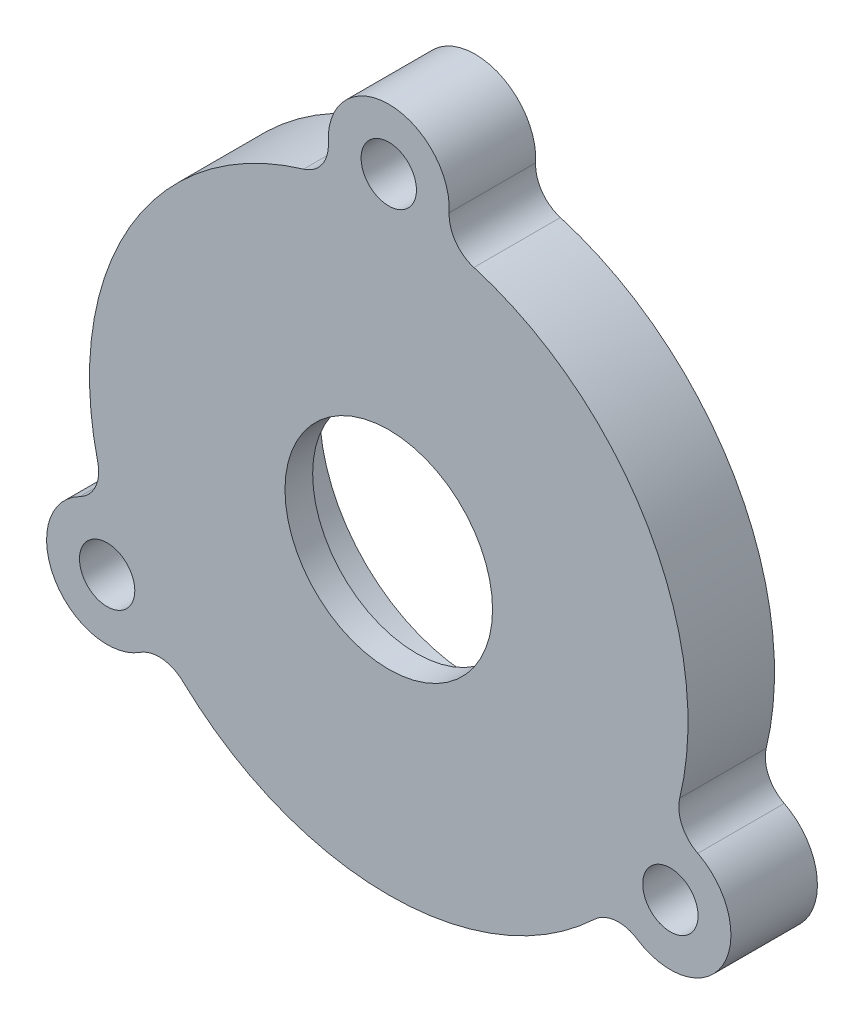
ISO-10303-21;
HEADER;
FILE_DESCRIPTION(('STEP AP214'),'2;1');
FILE_NAME('part.step','',(''),(''),'','','');
FILE_SCHEMA(('AUTOMOTIVE_DESIGN { 1 0 10303 214 1 1 1 1 }'));
ENDSEC;
DATA;
#1=APPLICATION_CONTEXT('core data for automotive mechanical design processes');
#2=APPLICATION_PROTOCOL_DEFINITION('international standard','automotive_design',2000,#1);
#3=PRODUCT_CONTEXT('',#1,'mechanical');
#4=PRODUCT('Part','Part','',(#3));
#5=PRODUCT_RELATED_PRODUCT_CATEGORY('part','',(#4));
#6=PRODUCT_DEFINITION_FORMATION('','',#4);
#7=PRODUCT_DEFINITION_CONTEXT('part definition',#1,'design');
#8=PRODUCT_DEFINITION('design','',#6,#7);
#9=PRODUCT_DEFINITION_SHAPE('','',#8);
#10=(LENGTH_UNIT() NAMED_UNIT(*) SI_UNIT(.MILLI.,.METRE.));
#11=(NAMED_UNIT(*) PLANE_ANGLE_UNIT() SI_UNIT($,.RADIAN.));
#12=(NAMED_UNIT(*) SI_UNIT($,.STERADIAN.) SOLID_ANGLE_UNIT());
#13=UNCERTAINTY_MEASURE_WITH_UNIT(LENGTH_MEASURE(1.E-05),#10,'distance_accuracy_value','');
#14=(GEOMETRIC_REPRESENTATION_CONTEXT(3) GLOBAL_UNCERTAINTY_ASSIGNED_CONTEXT((#13)) GLOBAL_UNIT_ASSIGNED_CONTEXT((#10,
#11,#12)) REPRESENTATION_CONTEXT('',''));
#15=CARTESIAN_POINT('',(0.,0.,0.));
#16=DIRECTION('',(0.,0.,1.));
#17=DIRECTION('',(1.,0.,0.));
#18=AXIS2_PLACEMENT_3D('',#15,#16,#17);
#19=CARTESIAN_POINT('',(0.,9.4,0.));
#20=DIRECTION('',(0.,0.,1.));
#21=DIRECTION('',(1.,0.,0.));
#22=AXIS2_PLACEMENT_3D('',#19,#20,#21);
#23=PLANE('',#22);
#24=CARTESIAN_POINT('',(0.,0.,0.));
#25=DIRECTION('',(0.,0.,-1.));
#26=DIRECTION('',(-1.,0.,0.));
#27=AXIS2_PLACEMENT_3D('',#24,#25,#26);
#28=CIRCLE('',#27,9.);
#29=CARTESIAN_POINT('',(-9.,0.,0.));
#30=VERTEX_POINT('',#29);
#31=EDGE_CURVE('E364',#30,#30,#28,.T.);
#32=ORIENTED_EDGE('',*,*,#31,.F.);
#33=EDGE_LOOP('',(#32));
#34=FACE_BOUND('',#33,.T.);
#35=CARTESIAN_POINT('',(0.,0.,0.));
#36=DIRECTION('',(0.,0.,-1.));
#37=DIRECTION('',(-1.,0.,0.));
#38=AXIS2_PLACEMENT_3D('',#35,#36,#37);
#39=CIRCLE('',#38,11.7);
#40=CARTESIAN_POINT('',(-11.7,0.,0.));
#41=VERTEX_POINT('',#40);
#42=EDGE_CURVE('E301',#41,#41,#39,.T.);
#43=ORIENTED_EDGE('',*,*,#42,.T.);
#44=EDGE_LOOP('',(#43));
#45=FACE_BOUND('',#44,.T.);
#46=ADVANCED_FACE('F37',(#34,#45),#23,.F.);
#47=CARTESIAN_POINT('',(0.,9.4,5.));
#48=DIRECTION('',(0.,0.,1.));
#49=DIRECTION('',(1.,0.,0.));
#50=AXIS2_PLACEMENT_3D('',#47,#48,#49);
#51=PLANE('',#50);
#52=CARTESIAN_POINT('',(16.2812775911475,-9.4,5.));
#53=DIRECTION('',(0.,0.,1.));
#54=DIRECTION('',(1.,0.,0.));
#55=AXIS2_PLACEMENT_3D('',#52,#53,#54);
#56=CIRCLE('',#55,1.6);
#57=CARTESIAN_POINT('',(17.8812775911475,-9.4,5.));
#58=VERTEX_POINT('',#57);
#59=EDGE_CURVE('E311',#58,#58,#56,.T.);
#60=ORIENTED_EDGE('',*,*,#59,.F.);
#61=EDGE_LOOP('',(#60));
#62=FACE_BOUND('',#61,.T.);
#63=CARTESIAN_POINT('',(0.,0.,5.));
#64=DIRECTION('',(0.,0.,1.));
#65=DIRECTION('',(1.,0.,0.));
#66=AXIS2_PLACEMENT_3D('',#63,#64,#65);
#67=CIRCLE('',#66,6.);
#68=CARTESIAN_POINT('',(6.,0.,5.));
#69=VERTEX_POINT('',#68);
#70=EDGE_CURVE('E153',#69,#69,#67,.T.);
#71=ORIENTED_EDGE('',*,*,#70,.F.);
#72=EDGE_LOOP('',(#71));
#73=FACE_BOUND('',#72,.T.);
#74=CARTESIAN_POINT('',(16.2812775911475,-9.4,5.));
#75=DIRECTION('',(0.,0.,1.));
#76=DIRECTION('',(1.,0.,0.));
#77=AXIS2_PLACEMENT_3D('',#74,#75,#76);
#78=CIRCLE('',#77,3.5);
#79=CARTESIAN_POINT('',(14.3696864320163,-12.331862759464,5.));
#80=VERTEX_POINT('',#79);
#81=CARTESIAN_POINT('',(17.8645496416872,-6.2785821148107,5.));
#82=VERTEX_POINT('',#81);
#83=EDGE_CURVE('E161',#80,#82,#78,.T.);
#84=ORIENTED_EDGE('',*,*,#83,.T.);
#85=CARTESIAN_POINT('',(18.7692765277099,-4.49491475184538,5.));
#86=DIRECTION('',(0.,0.,1.));
#87=DIRECTION('',(1.,0.,0.));
#88=AXIS2_PLACEMENT_3D('',#85,#86,#87);
#89=CIRCLE('',#88,2.);
#90=CARTESIAN_POINT('',(16.8242737787244,-4.02912047704275,5.));
#91=VERTEX_POINT('',#90);
#92=EDGE_CURVE('E137',#82,#91,#89,.F.);
#93=ORIENTED_EDGE('',*,*,#92,.T.);
#94=CARTESIAN_POINT('',(0.,0.,5.));
#95=DIRECTION('',(0.,0.,1.));
#96=DIRECTION('',(1.,0.,0.));
#97=AXIS2_PLACEMENT_3D('',#94,#95,#96);
#98=CIRCLE('',#97,17.3);
#99=CARTESIAN_POINT('',(4.92281620133512,16.5848087311212,5.));
#100=VERTEX_POINT('',#99);
#101=EDGE_CURVE('E145',#91,#100,#98,.T.);
#102=ORIENTED_EDGE('',*,*,#101,.T.);
#103=CARTESIAN_POINT('',(5.49192790091143,18.5021276595745,5.));
#104=DIRECTION('',(0.,0.,1.));
#105=DIRECTION('',(1.,0.,0.));
#106=AXIS2_PLACEMENT_3D('',#103,#104,#105);
#107=CIRCLE('',#106,2.);
#108=CARTESIAN_POINT('',(3.49486320967091,18.6104448742747,5.));
#109=VERTEX_POINT('',#108);
#110=EDGE_CURVE('E12',#100,#109,#107,.F.);
#111=ORIENTED_EDGE('',*,*,#110,.T.);
#112=CARTESIAN_POINT('',(0.,18.8,5.));
#113=DIRECTION('',(0.,0.,1.));
#114=DIRECTION('',(1.,0.,0.));
#115=AXIS2_PLACEMENT_3D('',#112,#113,#114);
#116=CIRCLE('',#115,3.5);
#117=CARTESIAN_POINT('',(-3.49486320967091,18.6104448742747,5.));
#118=VERTEX_POINT('',#117);
#119=EDGE_CURVE('E222',#109,#118,#116,.T.);
#120=ORIENTED_EDGE('',*,*,#119,.T.);
#121=CARTESIAN_POINT('',(-5.49192790091143,18.5021276595745,5.));
#122=DIRECTION('',(0.,0.,1.));
#123=DIRECTION('',(1.,0.,0.));
#124=AXIS2_PLACEMENT_3D('',#121,#122,#123);
#125=CIRCLE('',#124,2.);
#126=CARTESIAN_POINT('',(-4.92281620133512,16.5848087311212,5.));
#127=VERTEX_POINT('',#126);
#128=EDGE_CURVE('E212',#118,#127,#125,.F.);
#129=ORIENTED_EDGE('',*,*,#128,.T.);
#130=CARTESIAN_POINT('',(0.,0.,5.));
#131=DIRECTION('',(0.,0.,1.));
#132=DIRECTION('',(1.,0.,0.));
#133=AXIS2_PLACEMENT_3D('',#130,#131,#132);
#134=CIRCLE('',#133,17.3);
#135=CARTESIAN_POINT('',(-16.8242737787244,-4.02912047704276,5.));
#136=VERTEX_POINT('',#135);
#137=EDGE_CURVE('E220',#127,#136,#134,.T.);
#138=ORIENTED_EDGE('',*,*,#137,.T.);
#139=CARTESIAN_POINT('',(-18.7692765277099,-4.4949147518454,5.));
#140=DIRECTION('',(0.,0.,1.));
#141=DIRECTION('',(1.,0.,0.));
#142=AXIS2_PLACEMENT_3D('',#139,#140,#141);
#143=CIRCLE('',#142,2.);
#144=CARTESIAN_POINT('',(-17.8645496416872,-6.27858211481071,5.));
#145=VERTEX_POINT('',#144);
#146=EDGE_CURVE('E208',#136,#145,#143,.F.);
#147=ORIENTED_EDGE('',*,*,#146,.T.);
#148=CARTESIAN_POINT('',(-16.2812775911474,-9.40000000000001,5.));
#149=DIRECTION('',(0.,0.,1.));
#150=DIRECTION('',(1.,0.,0.));
#151=AXIS2_PLACEMENT_3D('',#148,#149,#150);
#152=CIRCLE('',#151,3.5);
#153=CARTESIAN_POINT('',(-14.3696864320163,-12.331862759464,5.));
#154=VERTEX_POINT('',#153);
#155=EDGE_CURVE('E229',#145,#154,#152,.T.);
#156=ORIENTED_EDGE('',*,*,#155,.T.);
#157=CARTESIAN_POINT('',(-13.2773486267985,-14.0072129077291,5.));
#158=DIRECTION('',(0.,0.,1.));
#159=DIRECTION('',(1.,0.,0.));
#160=AXIS2_PLACEMENT_3D('',#157,#158,#159);
#161=CIRCLE('',#160,2.);
#162=CARTESIAN_POINT('',(-11.9014575773893,-12.5556882540784,5.));
#163=VERTEX_POINT('',#162);
#164=EDGE_CURVE('E204',#154,#163,#161,.F.);
#165=ORIENTED_EDGE('',*,*,#164,.T.);
#166=CARTESIAN_POINT('',(0.,0.,5.));
#167=DIRECTION('',(0.,0.,1.));
#168=DIRECTION('',(1.,0.,0.));
#169=AXIS2_PLACEMENT_3D('',#166,#167,#168);
#170=CIRCLE('',#169,17.3);
#171=CARTESIAN_POINT('',(11.9014575773893,-12.5556882540784,5.));
#172=VERTEX_POINT('',#171);
#173=EDGE_CURVE('E240',#163,#172,#170,.T.);
#174=ORIENTED_EDGE('',*,*,#173,.T.);
#175=CARTESIAN_POINT('',(13.2773486267985,-14.0072129077291,5.));
#176=DIRECTION('',(0.,0.,1.));
#177=DIRECTION('',(1.,0.,0.));
#178=AXIS2_PLACEMENT_3D('',#175,#176,#177);
#179=CIRCLE('',#178,2.);
#180=EDGE_CURVE('E200',#172,#80,#179,.F.);
#181=ORIENTED_EDGE('',*,*,#180,.T.);
#182=EDGE_LOOP('',(#84,#93,#102,#111,#120,#129,#138,#147,#156,#165,#174,#181));
#183=FACE_BOUND('',#182,.T.);
#184=CARTESIAN_POINT('',(0.,18.8,5.));
#185=DIRECTION('',(0.,0.,1.));
#186=DIRECTION('',(1.,0.,0.));
#187=AXIS2_PLACEMENT_3D('',#184,#185,#186);
#188=CIRCLE('',#187,1.6);
#189=CARTESIAN_POINT('',(1.6,18.8,5.));
#190=VERTEX_POINT('',#189);
#191=EDGE_CURVE('E158',#190,#190,#188,.T.);
#192=ORIENTED_EDGE('',*,*,#191,.F.);
#193=EDGE_LOOP('',(#192));
#194=FACE_BOUND('',#193,.T.);
#195=CARTESIAN_POINT('',(-16.2812775911474,-9.40000000000001,5.));
#196=DIRECTION('',(0.,0.,1.));
#197=DIRECTION('',(1.,0.,0.));
#198=AXIS2_PLACEMENT_3D('',#195,#196,#197);
#199=CIRCLE('',#198,1.6);
#200=CARTESIAN_POINT('',(-14.6812775911474,-9.40000000000001,5.));
#201=VERTEX_POINT('',#200);
#202=EDGE_CURVE('E305',#201,#201,#199,.T.);
#203=ORIENTED_EDGE('',*,*,#202,.F.);
#204=EDGE_LOOP('',(#203));
#205=FACE_BOUND('',#204,.T.);
#206=ADVANCED_FACE('F218',(#62,#73,#183,#194,#205),#51,.T.);
#207=CARTESIAN_POINT('',(0.,0.,0.));
#208=DIRECTION('',(0.,0.,-1.));
#209=DIRECTION('',(-1.,0.,0.));
#210=AXIS2_PLACEMENT_3D('',#207,#208,#209);
#211=CIRCLE('',#210,15.8);
#212=CARTESIAN_POINT('',(-15.8,0.,0.));
#213=VERTEX_POINT('',#212);
#214=EDGE_CURVE('E292',#213,#213,#211,.T.);
#215=ORIENTED_EDGE('',*,*,#214,.F.);
#216=EDGE_LOOP('',(#215));
#217=FACE_BOUND('',#216,.T.);
#218=CARTESIAN_POINT('',(0.,0.,0.));
#219=DIRECTION('',(0.,0.,1.));
#220=DIRECTION('',(1.,0.,0.));
#221=AXIS2_PLACEMENT_3D('',#218,#219,#220);
#222=CIRCLE('',#221,17.3);
#223=CARTESIAN_POINT('',(16.8242737787244,-4.02912047704275,0.));
#224=VERTEX_POINT('',#223);
#225=CARTESIAN_POINT('',(4.92281620133512,16.5848087311212,0.));
#226=VERTEX_POINT('',#225);
#227=EDGE_CURVE('E143',#224,#226,#222,.T.);
#228=ORIENTED_EDGE('',*,*,#227,.F.);
#229=CARTESIAN_POINT('',(18.7692765277099,-4.49491475184538,0.));
#230=DIRECTION('',(0.,0.,1.));
#231=DIRECTION('',(1.,0.,0.));
#232=AXIS2_PLACEMENT_3D('',#229,#230,#231);
#233=CIRCLE('',#232,2.);
#234=CARTESIAN_POINT('',(17.8645496416872,-6.2785821148107,0.));
#235=VERTEX_POINT('',#234);
#236=EDGE_CURVE('E127',#224,#235,#233,.T.);
#237=ORIENTED_EDGE('',*,*,#236,.T.);
#238=CARTESIAN_POINT('',(16.2812775911475,-9.4,0.));
#239=DIRECTION('',(0.,0.,1.));
#240=DIRECTION('',(1.,0.,0.));
#241=AXIS2_PLACEMENT_3D('',#238,#239,#240);
#242=CIRCLE('',#241,3.5);
#243=CARTESIAN_POINT('',(14.3696864320163,-12.331862759464,0.));
#244=VERTEX_POINT('',#243);
#245=EDGE_CURVE('E172',#244,#235,#242,.T.);
#246=ORIENTED_EDGE('',*,*,#245,.F.);
#247=CARTESIAN_POINT('',(13.2773486267985,-14.0072129077291,0.));
#248=DIRECTION('',(0.,0.,1.));
#249=DIRECTION('',(1.,0.,0.));
#250=AXIS2_PLACEMENT_3D('',#247,#248,#249);
#251=CIRCLE('',#250,2.);
#252=CARTESIAN_POINT('',(11.9014575773893,-12.5556882540784,0.));
#253=VERTEX_POINT('',#252);
#254=EDGE_CURVE('E198',#244,#253,#251,.T.);
#255=ORIENTED_EDGE('',*,*,#254,.T.);
#256=CARTESIAN_POINT('',(0.,0.,0.));
#257=DIRECTION('',(0.,0.,1.));
#258=DIRECTION('',(1.,0.,0.));
#259=AXIS2_PLACEMENT_3D('',#256,#257,#258);
#260=CIRCLE('',#259,17.3);
#261=CARTESIAN_POINT('',(-11.9014575773893,-12.5556882540784,0.));
#262=VERTEX_POINT('',#261);
#263=EDGE_CURVE('E169',#262,#253,#260,.T.);
#264=ORIENTED_EDGE('',*,*,#263,.F.);
#265=CARTESIAN_POINT('',(-13.2773486267985,-14.0072129077291,0.));
#266=DIRECTION('',(0.,0.,1.));
#267=DIRECTION('',(1.,0.,0.));
#268=AXIS2_PLACEMENT_3D('',#265,#266,#267);
#269=CIRCLE('',#268,2.);
#270=CARTESIAN_POINT('',(-14.3696864320163,-12.331862759464,0.));
#271=VERTEX_POINT('',#270);
#272=EDGE_CURVE('E202',#262,#271,#269,.T.);
#273=ORIENTED_EDGE('',*,*,#272,.T.);
#274=CARTESIAN_POINT('',(-16.2812775911474,-9.40000000000001,0.));
#275=DIRECTION('',(0.,0.,1.));
#276=DIRECTION('',(1.,0.,0.));
#277=AXIS2_PLACEMENT_3D('',#274,#275,#276);
#278=CIRCLE('',#277,3.5);
#279=CARTESIAN_POINT('',(-17.8645496416872,-6.27858211481071,0.));
#280=VERTEX_POINT('',#279);
#281=EDGE_CURVE('E166',#280,#271,#278,.T.);
#282=ORIENTED_EDGE('',*,*,#281,.F.);
#283=CARTESIAN_POINT('',(-18.7692765277099,-4.4949147518454,0.));
#284=DIRECTION('',(0.,0.,1.));
#285=DIRECTION('',(1.,0.,0.));
#286=AXIS2_PLACEMENT_3D('',#283,#284,#285);
#287=CIRCLE('',#286,2.);
#288=CARTESIAN_POINT('',(-16.8242737787244,-4.02912047704276,0.));
#289=VERTEX_POINT('',#288);
#290=EDGE_CURVE('E206',#280,#289,#287,.T.);
#291=ORIENTED_EDGE('',*,*,#290,.T.);
#292=CARTESIAN_POINT('',(0.,0.,0.));
#293=DIRECTION('',(0.,0.,1.));
#294=DIRECTION('',(1.,0.,0.));
#295=AXIS2_PLACEMENT_3D('',#292,#293,#294);
#296=CIRCLE('',#295,17.3);
#297=CARTESIAN_POINT('',(-4.92281620133512,16.5848087311212,0.));
#298=VERTEX_POINT('',#297);
#299=EDGE_CURVE('E155',#298,#289,#296,.T.);
#300=ORIENTED_EDGE('',*,*,#299,.F.);
#301=CARTESIAN_POINT('',(-5.49192790091143,18.5021276595745,0.));
#302=DIRECTION('',(0.,0.,1.));
#303=DIRECTION('',(1.,0.,0.));
#304=AXIS2_PLACEMENT_3D('',#301,#302,#303);
#305=CIRCLE('',#304,2.);
#306=CARTESIAN_POINT('',(-3.49486320967091,18.6104448742747,0.));
#307=VERTEX_POINT('',#306);
#308=EDGE_CURVE('E210',#298,#307,#305,.T.);
#309=ORIENTED_EDGE('',*,*,#308,.T.);
#310=CARTESIAN_POINT('',(0.,18.8,0.));
#311=DIRECTION('',(0.,0.,1.));
#312=DIRECTION('',(1.,0.,0.));
#313=AXIS2_PLACEMENT_3D('',#310,#311,#312);
#314=CIRCLE('',#313,3.5);
#315=CARTESIAN_POINT('',(3.49486320967091,18.6104448742747,0.));
#316=VERTEX_POINT('',#315);
#317=EDGE_CURVE('E152',#316,#307,#314,.T.);
#318=ORIENTED_EDGE('',*,*,#317,.F.);
#319=CARTESIAN_POINT('',(5.49192790091143,18.5021276595745,0.));
#320=DIRECTION('',(0.,0.,1.));
#321=DIRECTION('',(1.,0.,0.));
#322=AXIS2_PLACEMENT_3D('',#319,#320,#321);
#323=CIRCLE('',#322,2.);
#324=EDGE_CURVE('E46',#316,#226,#323,.T.);
#325=ORIENTED_EDGE('',*,*,#324,.T.);
#326=EDGE_LOOP('',(#228,#237,#246,#255,#264,#273,#282,#291,#300,#309,#318,#325));
#327=FACE_BOUND('',#326,.T.);
#328=CARTESIAN_POINT('',(0.,18.8,0.));
#329=DIRECTION('',(0.,0.,1.));
#330=DIRECTION('',(1.,0.,0.));
#331=AXIS2_PLACEMENT_3D('',#328,#329,#330);
#332=CIRCLE('',#331,1.6);
#333=CARTESIAN_POINT('',(1.6,18.8,0.));
#334=VERTEX_POINT('',#333);
#335=EDGE_CURVE('E314',#334,#334,#332,.T.);
#336=ORIENTED_EDGE('',*,*,#335,.T.);
#337=EDGE_LOOP('',(#336));
#338=FACE_BOUND('',#337,.T.);
#339=CARTESIAN_POINT('',(16.2812775911475,-9.4,0.));
#340=DIRECTION('',(0.,0.,1.));
#341=DIRECTION('',(1.,0.,0.));
#342=AXIS2_PLACEMENT_3D('',#339,#340,#341);
#343=CIRCLE('',#342,1.6);
#344=CARTESIAN_POINT('',(17.8812775911475,-9.4,0.));
#345=VERTEX_POINT('',#344);
#346=EDGE_CURVE('E308',#345,#345,#343,.T.);
#347=ORIENTED_EDGE('',*,*,#346,.T.);
#348=EDGE_LOOP('',(#347));
#349=FACE_BOUND('',#348,.T.);
#350=CARTESIAN_POINT('',(-16.2812775911474,-9.40000000000001,0.));
#351=DIRECTION('',(0.,0.,1.));
#352=DIRECTION('',(1.,0.,0.));
#353=AXIS2_PLACEMENT_3D('',#350,#351,#352);
#354=CIRCLE('',#353,1.6);
#355=CARTESIAN_POINT('',(-14.6812775911474,-9.40000000000001,0.));
#356=VERTEX_POINT('',#355);
#357=EDGE_CURVE('E298',#356,#356,#354,.T.);
#358=ORIENTED_EDGE('',*,*,#357,.T.);
#359=EDGE_LOOP('',(#358));
#360=FACE_BOUND('',#359,.T.);
#361=ADVANCED_FACE('F149',(#217,#327,#338,#349,#360),#23,.F.);
#362=CARTESIAN_POINT('',(0.,0.,5.));
#363=DIRECTION('',(0.,0.,-1.));
#364=DIRECTION('',(-1.,0.,0.));
#365=AXIS2_PLACEMENT_3D('',#362,#363,#364);
#366=CYLINDRICAL_SURFACE('',#365,17.3);
#367=ORIENTED_EDGE('',*,*,#101,.F.);
#368=DIRECTION('',(0.,0.,-1.));
#369=VECTOR('',#368,1.);
#370=CARTESIAN_POINT('',(16.8242737787244,-4.02912047704275,5.));
#371=LINE('',#370,#369);
#372=EDGE_CURVE('E131',#91,#224,#371,.T.);
#373=ORIENTED_EDGE('',*,*,#372,.T.);
#374=ORIENTED_EDGE('',*,*,#227,.T.);
#375=DIRECTION('',(0.,0.,-1.));
#376=VECTOR('',#375,1.);
#377=CARTESIAN_POINT('',(4.92281620133512,16.5848087311212,5.));
#378=LINE('',#377,#376);
#379=EDGE_CURVE('E147',#226,#100,#378,.F.);
#380=ORIENTED_EDGE('',*,*,#379,.T.);
#381=EDGE_LOOP('',(#367,#373,#374,#380));
#382=FACE_BOUND('',#381,.T.);
#383=ADVANCED_FACE('F142',(#382),#366,.T.);
#384=CARTESIAN_POINT('',(0.,18.8,5.));
#385=DIRECTION('',(0.,0.,-1.));
#386=DIRECTION('',(-1.,0.,0.));
#387=AXIS2_PLACEMENT_3D('',#384,#385,#386);
#388=CYLINDRICAL_SURFACE('',#387,3.5);
#389=ORIENTED_EDGE('',*,*,#317,.T.);
#390=DIRECTION('',(0.,0.,-1.));
#391=VECTOR('',#390,1.);
#392=CARTESIAN_POINT('',(-3.49486320967091,18.6104448742747,5.));
#393=LINE('',#392,#391);
#394=EDGE_CURVE('E53',#307,#118,#393,.F.);
#395=ORIENTED_EDGE('',*,*,#394,.T.);
#396=ORIENTED_EDGE('',*,*,#119,.F.);
#397=DIRECTION('',(0.,0.,-1.));
#398=VECTOR('',#397,1.);
#399=CARTESIAN_POINT('',(3.49486320967091,18.6104448742747,5.));
#400=LINE('',#399,#398);
#401=EDGE_CURVE('E193',#109,#316,#400,.T.);
#402=ORIENTED_EDGE('',*,*,#401,.T.);
#403=EDGE_LOOP('',(#389,#395,#396,#402));
#404=FACE_BOUND('',#403,.T.);
#405=ADVANCED_FACE('F232',(#404),#388,.T.);
#406=CARTESIAN_POINT('',(0.,0.,5.));
#407=DIRECTION('',(0.,0.,-1.));
#408=DIRECTION('',(-1.,0.,0.));
#409=AXIS2_PLACEMENT_3D('',#406,#407,#408);
#410=CYLINDRICAL_SURFACE('',#409,17.3);
#411=ORIENTED_EDGE('',*,*,#299,.T.);
#412=DIRECTION('',(0.,0.,-1.));
#413=VECTOR('',#412,1.);
#414=CARTESIAN_POINT('',(-16.8242737787244,-4.02912047704276,5.));
#415=LINE('',#414,#413);
#416=EDGE_CURVE('E191',#289,#136,#415,.F.);
#417=ORIENTED_EDGE('',*,*,#416,.T.);
#418=ORIENTED_EDGE('',*,*,#137,.F.);
#419=DIRECTION('',(0.,0.,-1.));
#420=VECTOR('',#419,1.);
#421=CARTESIAN_POINT('',(-4.92281620133512,16.5848087311212,5.));
#422=LINE('',#421,#420);
#423=EDGE_CURVE('E188',#127,#298,#422,.T.);
#424=ORIENTED_EDGE('',*,*,#423,.T.);
#425=EDGE_LOOP('',(#411,#417,#418,#424));
#426=FACE_BOUND('',#425,.T.);
#427=ADVANCED_FACE('F226',(#426),#410,.T.);
#428=CARTESIAN_POINT('',(-16.2812775911474,-9.40000000000001,5.));
#429=DIRECTION('',(0.,0.,-1.));
#430=DIRECTION('',(-1.,0.,0.));
#431=AXIS2_PLACEMENT_3D('',#428,#429,#430);
#432=CYLINDRICAL_SURFACE('',#431,3.5);
#433=ORIENTED_EDGE('',*,*,#281,.T.);
#434=DIRECTION('',(0.,0.,-1.));
#435=VECTOR('',#434,1.);
#436=CARTESIAN_POINT('',(-14.3696864320163,-12.331862759464,5.));
#437=LINE('',#436,#435);
#438=EDGE_CURVE('E186',#271,#154,#437,.F.);
#439=ORIENTED_EDGE('',*,*,#438,.T.);
#440=ORIENTED_EDGE('',*,*,#155,.F.);
#441=DIRECTION('',(0.,0.,-1.));
#442=VECTOR('',#441,1.);
#443=CARTESIAN_POINT('',(-17.8645496416872,-6.27858211481071,5.));
#444=LINE('',#443,#442);
#445=EDGE_CURVE('E183',#145,#280,#444,.T.);
#446=ORIENTED_EDGE('',*,*,#445,.T.);
#447=EDGE_LOOP('',(#433,#439,#440,#446));
#448=FACE_BOUND('',#447,.T.);
#449=ADVANCED_FACE('F261',(#448),#432,.T.);
#450=CARTESIAN_POINT('',(0.,0.,5.));
#451=DIRECTION('',(0.,0.,-1.));
#452=DIRECTION('',(-1.,0.,0.));
#453=AXIS2_PLACEMENT_3D('',#450,#451,#452);
#454=CYLINDRICAL_SURFACE('',#453,17.3);
#455=ORIENTED_EDGE('',*,*,#263,.T.);
#456=DIRECTION('',(0.,0.,-1.));
#457=VECTOR('',#456,1.);
#458=CARTESIAN_POINT('',(11.9014575773893,-12.5556882540784,5.));
#459=LINE('',#458,#457);
#460=EDGE_CURVE('E181',#253,#172,#459,.F.);
#461=ORIENTED_EDGE('',*,*,#460,.T.);
#462=ORIENTED_EDGE('',*,*,#173,.F.);
#463=DIRECTION('',(0.,0.,-1.));
#464=VECTOR('',#463,1.);
#465=CARTESIAN_POINT('',(-11.9014575773893,-12.5556882540784,5.));
#466=LINE('',#465,#464);
#467=EDGE_CURVE('E178',#163,#262,#466,.T.);
#468=ORIENTED_EDGE('',*,*,#467,.T.);
#469=EDGE_LOOP('',(#455,#461,#462,#468));
#470=FACE_BOUND('',#469,.T.);
#471=ADVANCED_FACE('F253',(#470),#454,.T.);
#472=CARTESIAN_POINT('',(16.2812775911475,-9.4,5.));
#473=DIRECTION('',(0.,0.,-1.));
#474=DIRECTION('',(-1.,0.,0.));
#475=AXIS2_PLACEMENT_3D('',#472,#473,#474);
#476=CYLINDRICAL_SURFACE('',#475,3.5);
#477=ORIENTED_EDGE('',*,*,#245,.T.);
#478=DIRECTION('',(0.,0.,-1.));
#479=VECTOR('',#478,1.);
#480=CARTESIAN_POINT('',(17.8645496416872,-6.2785821148107,5.));
#481=LINE('',#480,#479);
#482=EDGE_CURVE('E132',#235,#82,#481,.F.);
#483=ORIENTED_EDGE('',*,*,#482,.T.);
#484=ORIENTED_EDGE('',*,*,#83,.F.);
#485=DIRECTION('',(0.,0.,-1.));
#486=VECTOR('',#485,1.);
#487=CARTESIAN_POINT('',(14.3696864320163,-12.331862759464,5.));
#488=LINE('',#487,#486);
#489=EDGE_CURVE('E146',#80,#244,#488,.T.);
#490=ORIENTED_EDGE('',*,*,#489,.T.);
#491=EDGE_LOOP('',(#477,#483,#484,#490));
#492=FACE_BOUND('',#491,.T.);
#493=ADVANCED_FACE('F247',(#492),#476,.T.);
#494=CARTESIAN_POINT('',(0.,0.,5.));
#495=DIRECTION('',(0.,0.,-1.));
#496=DIRECTION('',(-1.,0.,0.));
#497=AXIS2_PLACEMENT_3D('',#494,#495,#496);
#498=CYLINDRICAL_SURFACE('',#497,6.);
#499=CARTESIAN_POINT('',(0.,0.,3.4));
#500=DIRECTION('',(0.,0.,1.));
#501=DIRECTION('',(1.,0.,0.));
#502=AXIS2_PLACEMENT_3D('',#499,#500,#501);
#503=CIRCLE('',#502,6.);
#504=CARTESIAN_POINT('',(6.,0.,3.4));
#505=VERTEX_POINT('',#504);
#506=EDGE_CURVE('E41',#505,#505,#503,.T.);
#507=ORIENTED_EDGE('',*,*,#506,.F.);
#508=EDGE_LOOP('',(#507));
#509=FACE_BOUND('',#508,.T.);
#510=ORIENTED_EDGE('',*,*,#70,.T.);
#511=EDGE_LOOP('',(#510));
#512=FACE_BOUND('',#511,.T.);
#513=ADVANCED_FACE('F325',(#509,#512),#498,.F.);
#514=CARTESIAN_POINT('',(0.,18.8,5.));
#515=DIRECTION('',(0.,0.,-1.));
#516=DIRECTION('',(-1.,0.,0.));
#517=AXIS2_PLACEMENT_3D('',#514,#515,#516);
#518=CYLINDRICAL_SURFACE('',#517,1.6);
#519=ORIENTED_EDGE('',*,*,#191,.T.);
#520=EDGE_LOOP('',(#519));
#521=FACE_BOUND('',#520,.T.);
#522=ORIENTED_EDGE('',*,*,#335,.F.);
#523=EDGE_LOOP('',(#522));
#524=FACE_BOUND('',#523,.T.);
#525=ADVANCED_FACE('F322',(#521,#524),#518,.F.);
#526=CARTESIAN_POINT('',(16.2812775911475,-9.4,5.));
#527=DIRECTION('',(0.,0.,-1.));
#528=DIRECTION('',(-1.,0.,0.));
#529=AXIS2_PLACEMENT_3D('',#526,#527,#528);
#530=CYLINDRICAL_SURFACE('',#529,1.6);
#531=ORIENTED_EDGE('',*,*,#59,.T.);
#532=EDGE_LOOP('',(#531));
#533=FACE_BOUND('',#532,.T.);
#534=ORIENTED_EDGE('',*,*,#346,.F.);
#535=EDGE_LOOP('',(#534));
#536=FACE_BOUND('',#535,.T.);
#537=ADVANCED_FACE('F324',(#533,#536),#530,.F.);
#538=CARTESIAN_POINT('',(-16.2812775911474,-9.40000000000001,5.));
#539=DIRECTION('',(0.,0.,-1.));
#540=DIRECTION('',(-1.,0.,0.));
#541=AXIS2_PLACEMENT_3D('',#538,#539,#540);
#542=CYLINDRICAL_SURFACE('',#541,1.6);
#543=ORIENTED_EDGE('',*,*,#202,.T.);
#544=EDGE_LOOP('',(#543));
#545=FACE_BOUND('',#544,.T.);
#546=ORIENTED_EDGE('',*,*,#357,.F.);
#547=EDGE_LOOP('',(#546));
#548=FACE_BOUND('',#547,.T.);
#549=ADVANCED_FACE('F332',(#545,#548),#542,.F.);
#550=CARTESIAN_POINT('',(18.7692765277099,-4.49491475184538,5.));
#551=DIRECTION('',(0.,0.,1.));
#552=DIRECTION('',(1.,0.,0.));
#553=AXIS2_PLACEMENT_3D('',#550,#551,#552);
#554=CYLINDRICAL_SURFACE('',#553,2.);
#555=ORIENTED_EDGE('',*,*,#92,.F.);
#556=ORIENTED_EDGE('',*,*,#482,.F.);
#557=ORIENTED_EDGE('',*,*,#236,.F.);
#558=ORIENTED_EDGE('',*,*,#372,.F.);
#559=EDGE_LOOP('',(#555,#556,#557,#558));
#560=FACE_BOUND('',#559,.T.);
#561=ADVANCED_FACE('F130',(#560),#554,.F.);
#562=CARTESIAN_POINT('',(13.2773486267985,-14.0072129077291,5.));
#563=DIRECTION('',(0.,0.,1.));
#564=DIRECTION('',(1.,0.,0.));
#565=AXIS2_PLACEMENT_3D('',#562,#563,#564);
#566=CYLINDRICAL_SURFACE('',#565,2.);
#567=ORIENTED_EDGE('',*,*,#180,.F.);
#568=ORIENTED_EDGE('',*,*,#460,.F.);
#569=ORIENTED_EDGE('',*,*,#254,.F.);
#570=ORIENTED_EDGE('',*,*,#489,.F.);
#571=EDGE_LOOP('',(#567,#568,#569,#570));
#572=FACE_BOUND('',#571,.T.);
#573=ADVANCED_FACE('F249',(#572),#566,.F.);
#574=CARTESIAN_POINT('',(-13.2773486267985,-14.0072129077291,5.));
#575=DIRECTION('',(0.,0.,1.));
#576=DIRECTION('',(1.,0.,0.));
#577=AXIS2_PLACEMENT_3D('',#574,#575,#576);
#578=CYLINDRICAL_SURFACE('',#577,2.);
#579=ORIENTED_EDGE('',*,*,#164,.F.);
#580=ORIENTED_EDGE('',*,*,#438,.F.);
#581=ORIENTED_EDGE('',*,*,#272,.F.);
#582=ORIENTED_EDGE('',*,*,#467,.F.);
#583=EDGE_LOOP('',(#579,#580,#581,#582));
#584=FACE_BOUND('',#583,.T.);
#585=ADVANCED_FACE('F257',(#584),#578,.F.);
#586=CARTESIAN_POINT('',(-18.7692765277099,-4.4949147518454,5.));
#587=DIRECTION('',(0.,0.,1.));
#588=DIRECTION('',(1.,0.,0.));
#589=AXIS2_PLACEMENT_3D('',#586,#587,#588);
#590=CYLINDRICAL_SURFACE('',#589,2.);
#591=ORIENTED_EDGE('',*,*,#146,.F.);
#592=ORIENTED_EDGE('',*,*,#416,.F.);
#593=ORIENTED_EDGE('',*,*,#290,.F.);
#594=ORIENTED_EDGE('',*,*,#445,.F.);
#595=EDGE_LOOP('',(#591,#592,#593,#594));
#596=FACE_BOUND('',#595,.T.);
#597=ADVANCED_FACE('F265',(#596),#590,.F.);
#598=CARTESIAN_POINT('',(-5.49192790091143,18.5021276595745,5.));
#599=DIRECTION('',(0.,0.,1.));
#600=DIRECTION('',(1.,0.,0.));
#601=AXIS2_PLACEMENT_3D('',#598,#599,#600);
#602=CYLINDRICAL_SURFACE('',#601,2.);
#603=ORIENTED_EDGE('',*,*,#128,.F.);
#604=ORIENTED_EDGE('',*,*,#394,.F.);
#605=ORIENTED_EDGE('',*,*,#308,.F.);
#606=ORIENTED_EDGE('',*,*,#423,.F.);
#607=EDGE_LOOP('',(#603,#604,#605,#606));
#608=FACE_BOUND('',#607,.T.);
#609=ADVANCED_FACE('F231',(#608),#602,.F.);
#610=CARTESIAN_POINT('',(5.49192790091143,18.5021276595745,5.));
#611=DIRECTION('',(0.,0.,1.));
#612=DIRECTION('',(1.,0.,0.));
#613=AXIS2_PLACEMENT_3D('',#610,#611,#612);
#614=CYLINDRICAL_SURFACE('',#613,2.);
#615=ORIENTED_EDGE('',*,*,#110,.F.);
#616=ORIENTED_EDGE('',*,*,#379,.F.);
#617=ORIENTED_EDGE('',*,*,#324,.F.);
#618=ORIENTED_EDGE('',*,*,#401,.F.);
#619=EDGE_LOOP('',(#615,#616,#617,#618));
#620=FACE_BOUND('',#619,.T.);
#621=ADVANCED_FACE('F39',(#620),#614,.F.);
#622=CARTESIAN_POINT('',(0.,0.,2.5));
#623=DIRECTION('',(0.,0.,-1.));
#624=DIRECTION('',(-1.,0.,0.));
#625=AXIS2_PLACEMENT_3D('',#622,#623,#624);
#626=CYLINDRICAL_SURFACE('',#625,15.8);
#627=CARTESIAN_POINT('',(0.,0.,2.5));
#628=DIRECTION('',(0.,0.,-1.));
#629=DIRECTION('',(-1.,0.,0.));
#630=AXIS2_PLACEMENT_3D('',#627,#628,#629);
#631=CIRCLE('',#630,15.8);
#632=CARTESIAN_POINT('',(-15.8,0.,2.5));
#633=VERTEX_POINT('',#632);
#634=EDGE_CURVE('E294',#633,#633,#631,.T.);
#635=ORIENTED_EDGE('',*,*,#634,.F.);
#636=EDGE_LOOP('',(#635));
#637=FACE_BOUND('',#636,.T.);
#638=ORIENTED_EDGE('',*,*,#214,.T.);
#639=EDGE_LOOP('',(#638));
#640=FACE_BOUND('',#639,.T.);
#641=ADVANCED_FACE('F341',(#637,#640),#626,.F.);
#642=CARTESIAN_POINT('',(0.,0.,2.5));
#643=DIRECTION('',(0.,0.,-1.));
#644=DIRECTION('',(-1.,0.,0.));
#645=AXIS2_PLACEMENT_3D('',#642,#643,#644);
#646=PLANE('',#645);
#647=CARTESIAN_POINT('',(0.,0.,2.5));
#648=DIRECTION('',(0.,0.,-1.));
#649=DIRECTION('',(-1.,0.,0.));
#650=AXIS2_PLACEMENT_3D('',#647,#648,#649);
#651=CIRCLE('',#650,11.7);
#652=CARTESIAN_POINT('',(-11.7,0.,2.5));
#653=VERTEX_POINT('',#652);
#654=EDGE_CURVE('E295',#653,#653,#651,.T.);
#655=ORIENTED_EDGE('',*,*,#654,.F.);
#656=EDGE_LOOP('',(#655));
#657=FACE_BOUND('',#656,.T.);
#658=ORIENTED_EDGE('',*,*,#634,.T.);
#659=EDGE_LOOP('',(#658));
#660=FACE_BOUND('',#659,.T.);
#661=ADVANCED_FACE('F344',(#657,#660),#646,.T.);
#662=CARTESIAN_POINT('',(0.,0.,2.5));
#663=DIRECTION('',(0.,0.,-1.));
#664=DIRECTION('',(-1.,0.,0.));
#665=AXIS2_PLACEMENT_3D('',#662,#663,#664);
#666=CYLINDRICAL_SURFACE('',#665,11.7);
#667=ORIENTED_EDGE('',*,*,#654,.T.);
#668=EDGE_LOOP('',(#667));
#669=FACE_BOUND('',#668,.T.);
#670=ORIENTED_EDGE('',*,*,#42,.F.);
#671=EDGE_LOOP('',(#670));
#672=FACE_BOUND('',#671,.T.);
#673=ADVANCED_FACE('F348',(#669,#672),#666,.T.);
#674=CARTESIAN_POINT('',(0.,9.4,3.4));
#675=DIRECTION('',(0.,0.,1.));
#676=DIRECTION('',(1.,0.,0.));
#677=AXIS2_PLACEMENT_3D('',#674,#675,#676);
#678=PLANE('',#677);
#679=ORIENTED_EDGE('',*,*,#506,.T.);
#680=EDGE_LOOP('',(#679));
#681=FACE_BOUND('',#680,.T.);
#682=CARTESIAN_POINT('',(0.,0.,3.4));
#683=DIRECTION('',(0.,0.,1.));
#684=DIRECTION('',(1.,0.,0.));
#685=AXIS2_PLACEMENT_3D('',#682,#683,#684);
#686=CIRCLE('',#685,9.);
#687=CARTESIAN_POINT('',(9.,0.,3.4));
#688=VERTEX_POINT('',#687);
#689=EDGE_CURVE('E367',#688,#688,#686,.F.);
#690=ORIENTED_EDGE('',*,*,#689,.T.);
#691=EDGE_LOOP('',(#690));
#692=FACE_BOUND('',#691,.T.);
#693=ADVANCED_FACE('F352',(#681,#692),#678,.F.);
#694=CARTESIAN_POINT('',(0.,0.,30.4558441227157));
#695=DIRECTION('',(0.,0.,-1.));
#696=DIRECTION('',(-1.,0.,0.));
#697=AXIS2_PLACEMENT_3D('',#694,#695,#696);
#698=CYLINDRICAL_SURFACE('',#697,9.);
#699=ORIENTED_EDGE('',*,*,#31,.T.);
#700=EDGE_LOOP('',(#699));
#701=FACE_BOUND('',#700,.T.);
#702=ORIENTED_EDGE('',*,*,#689,.F.);
#703=EDGE_LOOP('',(#702));
#704=FACE_BOUND('',#703,.T.);
#705=ADVANCED_FACE('F356',(#701,#704),#698,.F.);
#706=CLOSED_SHELL('',(#46,#206,#361,#383,#405,#427,#449,#471,#493,#513,#525,#537,#549,#561,#573,
#585,#597,#609,#621,#641,#661,#673,#693,#705));
#707=MANIFOLD_SOLID_BREP('B2',#706);
#708=ADVANCED_BREP_SHAPE_REPRESENTATION('',(#18,#707),#14);
#709=SHAPE_DEFINITION_REPRESENTATION(#9,#708);
ENDSEC;
END-ISO-10303-21;
